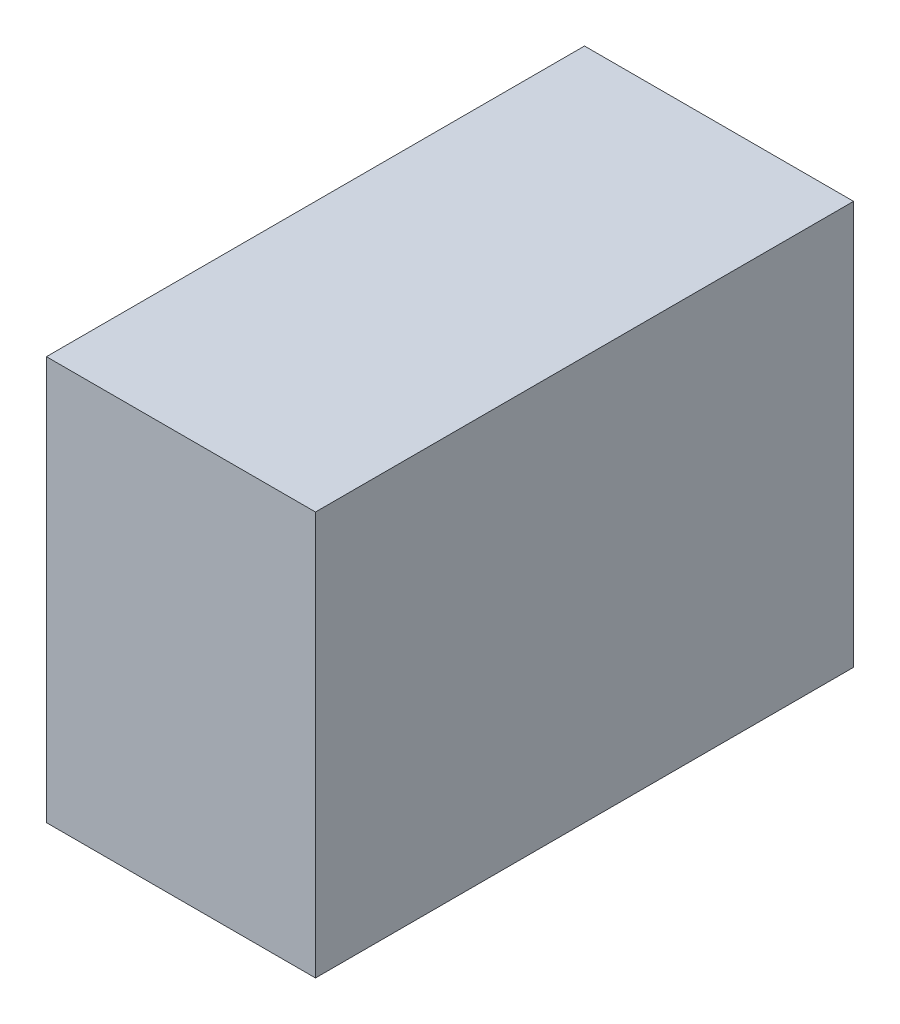
ISO-10303-21;
HEADER;
FILE_DESCRIPTION(('STEP AP214'),'2;1');
FILE_NAME('part.step','',(''),(''),'','','');
FILE_SCHEMA(('AUTOMOTIVE_DESIGN { 1 0 10303 214 1 1 1 1 }'));
ENDSEC;
DATA;
#1=APPLICATION_CONTEXT('core data for automotive mechanical design processes');
#2=APPLICATION_PROTOCOL_DEFINITION('international standard','automotive_design',2000,#1);
#3=PRODUCT_CONTEXT('',#1,'mechanical');
#4=PRODUCT('Part','Part','',(#3));
#5=PRODUCT_RELATED_PRODUCT_CATEGORY('part','',(#4));
#6=PRODUCT_DEFINITION_FORMATION('','',#4);
#7=PRODUCT_DEFINITION_CONTEXT('part definition',#1,'design');
#8=PRODUCT_DEFINITION('design','',#6,#7);
#9=PRODUCT_DEFINITION_SHAPE('','',#8);
#10=(LENGTH_UNIT() NAMED_UNIT(*) SI_UNIT(.MILLI.,.METRE.));
#11=(NAMED_UNIT(*) PLANE_ANGLE_UNIT() SI_UNIT($,.RADIAN.));
#12=(NAMED_UNIT(*) SI_UNIT($,.STERADIAN.) SOLID_ANGLE_UNIT());
#13=UNCERTAINTY_MEASURE_WITH_UNIT(LENGTH_MEASURE(1.E-05),#10,'distance_accuracy_value','');
#14=(GEOMETRIC_REPRESENTATION_CONTEXT(3) GLOBAL_UNCERTAINTY_ASSIGNED_CONTEXT((#13)) GLOBAL_UNIT_ASSIGNED_CONTEXT((#10,
#11,#12)) REPRESENTATION_CONTEXT('',''));
#15=CARTESIAN_POINT('',(0.,0.,0.));
#16=DIRECTION('',(0.,0.,1.));
#17=DIRECTION('',(1.,0.,0.));
#18=AXIS2_PLACEMENT_3D('',#15,#16,#17);
#19=CARTESIAN_POINT('',(0.,30.,40.));
#20=DIRECTION('',(1.,0.,0.));
#21=DIRECTION('',(0.,0.,-1.));
#22=AXIS2_PLACEMENT_3D('',#19,#20,#21);
#23=PLANE('',#22);
#24=DIRECTION('',(0.,-1.,0.));
#25=VECTOR('',#24,1.);
#26=CARTESIAN_POINT('',(0.,30.,0.));
#27=LINE('',#26,#25);
#28=CARTESIAN_POINT('',(0.,30.,0.));
#29=VERTEX_POINT('',#28);
#30=CARTESIAN_POINT('',(0.,0.,0.));
#31=VERTEX_POINT('',#30);
#32=EDGE_CURVE('E106',#29,#31,#27,.T.);
#33=ORIENTED_EDGE('',*,*,#32,.T.);
#34=DIRECTION('',(0.,0.,-1.));
#35=VECTOR('',#34,1.);
#36=CARTESIAN_POINT('',(0.,0.,40.));
#37=LINE('',#36,#35);
#38=CARTESIAN_POINT('',(0.,0.,40.));
#39=VERTEX_POINT('',#38);
#40=EDGE_CURVE('E11',#39,#31,#37,.T.);
#41=ORIENTED_EDGE('',*,*,#40,.F.);
#42=DIRECTION('',(0.,-1.,0.));
#43=VECTOR('',#42,1.);
#44=CARTESIAN_POINT('',(0.,30.,40.));
#45=LINE('',#44,#43);
#46=CARTESIAN_POINT('',(0.,30.,40.));
#47=VERTEX_POINT('',#46);
#48=EDGE_CURVE('E94',#47,#39,#45,.T.);
#49=ORIENTED_EDGE('',*,*,#48,.F.);
#50=DIRECTION('',(0.,0.,-1.));
#51=VECTOR('',#50,1.);
#52=CARTESIAN_POINT('',(0.,30.,40.));
#53=LINE('',#52,#51);
#54=EDGE_CURVE('E102',#47,#29,#53,.T.);
#55=ORIENTED_EDGE('',*,*,#54,.T.);
#56=EDGE_LOOP('',(#33,#41,#49,#55));
#57=FACE_BOUND('',#56,.T.);
#58=ADVANCED_FACE('F43',(#57),#23,.F.);
#59=CARTESIAN_POINT('',(0.,0.,40.));
#60=DIRECTION('',(0.,1.,0.));
#61=DIRECTION('',(0.,0.,1.));
#62=AXIS2_PLACEMENT_3D('',#59,#60,#61);
#63=PLANE('',#62);
#64=DIRECTION('',(1.,0.,0.));
#65=VECTOR('',#64,1.);
#66=CARTESIAN_POINT('',(0.,0.,0.));
#67=LINE('',#66,#65);
#68=CARTESIAN_POINT('',(20.,0.,0.));
#69=VERTEX_POINT('',#68);
#70=EDGE_CURVE('E98',#31,#69,#67,.T.);
#71=ORIENTED_EDGE('',*,*,#70,.T.);
#72=DIRECTION('',(0.,0.,-1.));
#73=VECTOR('',#72,1.);
#74=CARTESIAN_POINT('',(20.,0.,40.));
#75=LINE('',#74,#73);
#76=CARTESIAN_POINT('',(20.,0.,40.));
#77=VERTEX_POINT('',#76);
#78=EDGE_CURVE('E51',#77,#69,#75,.T.);
#79=ORIENTED_EDGE('',*,*,#78,.F.);
#80=DIRECTION('',(1.,0.,0.));
#81=VECTOR('',#80,1.);
#82=CARTESIAN_POINT('',(0.,0.,40.));
#83=LINE('',#82,#81);
#84=EDGE_CURVE('E89',#39,#77,#83,.T.);
#85=ORIENTED_EDGE('',*,*,#84,.F.);
#86=ORIENTED_EDGE('',*,*,#40,.T.);
#87=EDGE_LOOP('',(#71,#79,#85,#86));
#88=FACE_BOUND('',#87,.T.);
#89=ADVANCED_FACE('F97',(#88),#63,.F.);
#90=CARTESIAN_POINT('',(20.,0.,40.));
#91=DIRECTION('',(-1.,0.,0.));
#92=DIRECTION('',(0.,0.,1.));
#93=AXIS2_PLACEMENT_3D('',#90,#91,#92);
#94=PLANE('',#93);
#95=DIRECTION('',(0.,1.,0.));
#96=VECTOR('',#95,1.);
#97=CARTESIAN_POINT('',(20.,0.,0.));
#98=LINE('',#97,#96);
#99=CARTESIAN_POINT('',(20.,30.,0.));
#100=VERTEX_POINT('',#99);
#101=EDGE_CURVE('E76',#69,#100,#98,.T.);
#102=ORIENTED_EDGE('',*,*,#101,.T.);
#103=DIRECTION('',(0.,0.,-1.));
#104=VECTOR('',#103,1.);
#105=CARTESIAN_POINT('',(20.,30.,40.));
#106=LINE('',#105,#104);
#107=CARTESIAN_POINT('',(20.,30.,40.));
#108=VERTEX_POINT('',#107);
#109=EDGE_CURVE('E99',#108,#100,#106,.T.);
#110=ORIENTED_EDGE('',*,*,#109,.F.);
#111=DIRECTION('',(0.,1.,0.));
#112=VECTOR('',#111,1.);
#113=CARTESIAN_POINT('',(20.,0.,40.));
#114=LINE('',#113,#112);
#115=EDGE_CURVE('E92',#77,#108,#114,.T.);
#116=ORIENTED_EDGE('',*,*,#115,.F.);
#117=ORIENTED_EDGE('',*,*,#78,.T.);
#118=EDGE_LOOP('',(#102,#110,#116,#117));
#119=FACE_BOUND('',#118,.T.);
#120=ADVANCED_FACE('F100',(#119),#94,.F.);
#121=CARTESIAN_POINT('',(20.,30.,40.));
#122=DIRECTION('',(0.,-1.,0.));
#123=DIRECTION('',(0.,0.,-1.));
#124=AXIS2_PLACEMENT_3D('',#121,#122,#123);
#125=PLANE('',#124);
#126=DIRECTION('',(-1.,0.,0.));
#127=VECTOR('',#126,1.);
#128=CARTESIAN_POINT('',(20.,30.,0.));
#129=LINE('',#128,#127);
#130=EDGE_CURVE('E82',#100,#29,#129,.T.);
#131=ORIENTED_EDGE('',*,*,#130,.T.);
#132=ORIENTED_EDGE('',*,*,#54,.F.);
#133=DIRECTION('',(-1.,0.,0.));
#134=VECTOR('',#133,1.);
#135=CARTESIAN_POINT('',(20.,30.,40.));
#136=LINE('',#135,#134);
#137=EDGE_CURVE('E59',#108,#47,#136,.T.);
#138=ORIENTED_EDGE('',*,*,#137,.F.);
#139=ORIENTED_EDGE('',*,*,#109,.T.);
#140=EDGE_LOOP('',(#131,#132,#138,#139));
#141=FACE_BOUND('',#140,.T.);
#142=ADVANCED_FACE('F113',(#141),#125,.F.);
#143=CARTESIAN_POINT('',(0.,0.,40.));
#144=DIRECTION('',(0.,0.,1.));
#145=DIRECTION('',(1.,0.,0.));
#146=AXIS2_PLACEMENT_3D('',#143,#144,#145);
#147=PLANE('',#146);
#148=ORIENTED_EDGE('',*,*,#48,.T.);
#149=ORIENTED_EDGE('',*,*,#84,.T.);
#150=ORIENTED_EDGE('',*,*,#115,.T.);
#151=ORIENTED_EDGE('',*,*,#137,.T.);
#152=EDGE_LOOP('',(#148,#149,#150,#151));
#153=FACE_BOUND('',#152,.T.);
#154=ADVANCED_FACE('F90',(#153),#147,.T.);
#155=CARTESIAN_POINT('',(0.,0.,0.));
#156=DIRECTION('',(0.,0.,1.));
#157=DIRECTION('',(1.,0.,0.));
#158=AXIS2_PLACEMENT_3D('',#155,#156,#157);
#159=PLANE('',#158);
#160=ORIENTED_EDGE('',*,*,#32,.F.);
#161=ORIENTED_EDGE('',*,*,#130,.F.);
#162=ORIENTED_EDGE('',*,*,#101,.F.);
#163=ORIENTED_EDGE('',*,*,#70,.F.);
#164=EDGE_LOOP('',(#160,#161,#162,#163));
#165=FACE_BOUND('',#164,.T.);
#166=ADVANCED_FACE('F116',(#165),#159,.F.);
#167=CLOSED_SHELL('',(#58,#89,#120,#142,#154,#166));
#168=MANIFOLD_SOLID_BREP('B2',#167);
#169=ADVANCED_BREP_SHAPE_REPRESENTATION('',(#18,#168),#14);
#170=SHAPE_DEFINITION_REPRESENTATION(#9,#169);
ENDSEC;
END-ISO-10303-21;
